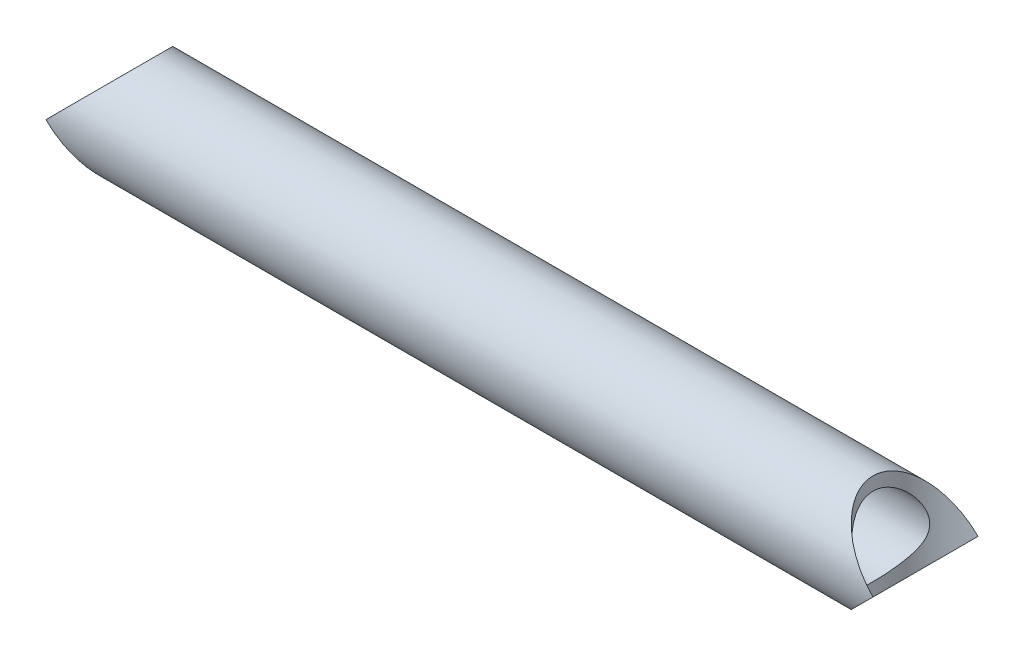
ISO-10303-21;
HEADER;
FILE_DESCRIPTION(('STEP AP214'),'2;1');
FILE_NAME('part.step','',(''),(''),'','','');
FILE_SCHEMA(('AUTOMOTIVE_DESIGN { 1 0 10303 214 1 1 1 1 }'));
ENDSEC;
DATA;
#1=APPLICATION_CONTEXT('core data for automotive mechanical design processes');
#2=APPLICATION_PROTOCOL_DEFINITION('international standard','automotive_design',2000,#1);
#3=PRODUCT_CONTEXT('',#1,'mechanical');
#4=PRODUCT('Part','Part','',(#3));
#5=PRODUCT_RELATED_PRODUCT_CATEGORY('part','',(#4));
#6=PRODUCT_DEFINITION_FORMATION('','',#4);
#7=PRODUCT_DEFINITION_CONTEXT('part definition',#1,'design');
#8=PRODUCT_DEFINITION('design','',#6,#7);
#9=PRODUCT_DEFINITION_SHAPE('','',#8);
#10=(LENGTH_UNIT() NAMED_UNIT(*) SI_UNIT(.MILLI.,.METRE.));
#11=(NAMED_UNIT(*) PLANE_ANGLE_UNIT() SI_UNIT($,.RADIAN.));
#12=(NAMED_UNIT(*) SI_UNIT($,.STERADIAN.) SOLID_ANGLE_UNIT());
#13=UNCERTAINTY_MEASURE_WITH_UNIT(LENGTH_MEASURE(1.E-05),#10,'distance_accuracy_value','');
#14=(GEOMETRIC_REPRESENTATION_CONTEXT(3) GLOBAL_UNCERTAINTY_ASSIGNED_CONTEXT((#13)) GLOBAL_UNIT_ASSIGNED_CONTEXT((#10,
#11,#12)) REPRESENTATION_CONTEXT('',''));
#15=CARTESIAN_POINT('',(0.,0.,0.));
#16=DIRECTION('',(0.,0.,1.));
#17=DIRECTION('',(1.,0.,0.));
#18=AXIS2_PLACEMENT_3D('',#15,#16,#17);
#19=CARTESIAN_POINT('',(150.,0.,0.));
#20=DIRECTION('',(-1.,0.,0.));
#21=DIRECTION('',(0.,0.,1.));
#22=AXIS2_PLACEMENT_3D('',#19,#20,#21);
#23=CYLINDRICAL_SURFACE('',#22,7.112);
#24=CARTESIAN_POINT('',(143.663985400901,0.,7.112));
#25=CARTESIAN_POINT('',(143.663996641076,-0.166349670109117,7.11200542496663));
#26=CARTESIAN_POINT('',(143.657404223324,-0.332656715788198,7.10615199880944));
#27=CARTESIAN_POINT('',(143.631470740375,-0.663523825017278,7.08292127323138));
#28=CARTESIAN_POINT('',(143.612124974971,-0.828083221748087,7.06553972514323));
#29=CARTESIAN_POINT('',(143.561744636123,-1.15416223004984,7.01966098991535));
#30=CARTESIAN_POINT('',(143.530684563052,-1.31567439721789,6.99113954867282));
#31=CARTESIAN_POINT('',(143.458460168107,-1.63424608097507,6.92360605423908));
#32=CARTESIAN_POINT('',(143.417289790225,-1.79130286568734,6.88458771212787));
#33=CARTESIAN_POINT('',(143.32727049625,-2.09795951420525,6.79736460316442));
#34=CARTESIAN_POINT('',(143.278538761654,-2.2476335446951,6.74929797045726));
#35=CARTESIAN_POINT('',(143.174668643161,-2.54144419684285,6.64424190459665));
#36=CARTESIAN_POINT('',(143.119530964134,-2.68558142541811,6.5872534529055));
#37=CARTESIAN_POINT('',(142.946854896937,-3.10942256788375,6.40365866022099));
#38=CARTESIAN_POINT('',(142.821982070976,-3.38078378140906,6.26435673087727));
#39=CARTESIAN_POINT('',(142.614545086204,-3.79713432089284,6.01627855015697));
#40=CARTESIAN_POINT('',(142.534819523203,-3.94959627846688,5.91727408898425));
#41=CARTESIAN_POINT('',(142.373835892581,-4.24603410366044,5.70829336546771));
#42=CARTESIAN_POINT('',(142.2925776999,-4.39000927477523,5.59831620459077));
#43=CARTESIAN_POINT('',(142.130093006519,-4.66939820716648,5.36750853203372));
#44=CARTESIAN_POINT('',(142.048866715486,-4.80479949311307,5.24666279766905));
#45=CARTESIAN_POINT('',(141.888061556412,-5.06646938894745,4.99444196004728));
#46=CARTESIAN_POINT('',(141.808482693744,-5.19273796904927,4.86306682245189));
#47=CARTESIAN_POINT('',(141.636624067042,-5.46017346508923,4.56237823124014));
#48=CARTESIAN_POINT('',(141.545023387841,-5.59920216668466,4.39075994838316));
#49=CARTESIAN_POINT('',(141.36862628109,-5.86216963735668,4.03296442783786));
#50=CARTESIAN_POINT('',(141.283831365253,-5.98610505702061,3.84678397359704));
#51=CARTESIAN_POINT('',(141.123576020029,-6.21713184733541,3.46096432873019));
#52=CARTESIAN_POINT('',(141.048098268393,-6.32425457958228,3.26135121340756));
#53=CARTESIAN_POINT('',(140.908635931519,-6.52016509318987,2.84954555651433));
#54=CARTESIAN_POINT('',(140.844645346866,-6.60896244900998,2.63735965881644));
#55=CARTESIAN_POINT('',(140.74745668559,-6.7428410088665,2.26736286905207));
#56=CARTESIAN_POINT('',(140.710776204828,-6.79305007975762,2.11229960346451));
#57=CARTESIAN_POINT('',(140.644792625311,-6.88300525963278,1.79764750134156));
#58=CARTESIAN_POINT('',(140.615487773836,-6.92275385451097,1.63805975003805));
#59=CARTESIAN_POINT('',(140.564853362971,-6.99124038582518,1.31540267475928));
#60=CARTESIAN_POINT('',(140.54351850093,-7.01998564339596,1.15233574220806));
#61=CARTESIAN_POINT('',(140.509246017588,-7.06608578872199,0.823712741278338));
#62=CARTESIAN_POINT('',(140.496308696254,-7.08344026958986,0.658156584198852));
#63=CARTESIAN_POINT('',(140.479096513059,-7.10651684632692,0.325354079998925));
#64=CARTESIAN_POINT('',(140.474844029849,-7.11220889114596,0.158104479624482));
#65=CARTESIAN_POINT('',(140.475164727068,-7.11177938083808,-0.176370252527408));
#66=CARTESIAN_POINT('',(140.479737872744,-7.10565787223131,-0.343595384398614));
#67=CARTESIAN_POINT('',(140.497608099073,-7.08169714102487,-0.676764225577558));
#68=CARTESIAN_POINT('',(140.510906931535,-7.06385556544857,-0.842707670797739));
#69=CARTESIAN_POINT('',(140.545934688785,-7.0167312617276,-1.17205052867149));
#70=CARTESIAN_POINT('',(140.567663562189,-6.98744860331889,-1.3354499568251));
#71=CARTESIAN_POINT('',(140.618223329213,-6.91904371625514,-1.65314148305557));
#72=CARTESIAN_POINT('',(140.646789565119,-6.88028722295748,-1.80755478326129));
#73=CARTESIAN_POINT('',(140.710826490523,-6.79297702240907,-2.11214174822096));
#74=CARTESIAN_POINT('',(140.746299584904,-6.74441990248373,-2.26231391534985));
#75=CARTESIAN_POINT('',(140.862157284933,-6.58486841142567,-2.70525009366833));
#76=CARTESIAN_POINT('',(140.952018305287,-6.45994330046454,-2.99066416134719));
#77=CARTESIAN_POINT('',(141.162195416905,-6.16230481700326,-3.56694153174842));
#78=CARTESIAN_POINT('',(141.28475977353,-5.98587375085425,-3.85502703449937));
#79=CARTESIAN_POINT('',(141.546229043831,-5.59836645467707,-4.39891475025042));
#80=CARTESIAN_POINT('',(141.685148133142,-5.38726010592607,-4.65468855278165));
#81=CARTESIAN_POINT('',(141.913538546123,-5.02560742572235,-5.03612242565989));
#82=CARTESIAN_POINT('',(142.000452347553,-4.88480641586235,-5.17277156285501));
#83=CARTESIAN_POINT('',(142.175381088262,-4.59274197273799,-5.43374777854851));
#84=CARTESIAN_POINT('',(142.263396238067,-4.44147651332437,-5.55807245935771));
#85=CARTESIAN_POINT('',(142.438557956338,-4.12881411640284,-5.7941209208767));
#86=CARTESIAN_POINT('',(142.525704079796,-3.96741226889234,-5.90583852036448));
#87=CARTESIAN_POINT('',(142.696845667575,-3.63473952919308,-6.11620224003216));
#88=CARTESIAN_POINT('',(142.780841850923,-3.46347091217881,-6.21485135649468));
#89=CARTESIAN_POINT('',(142.926803073655,-3.14652775194739,-6.38005576529697));
#90=CARTESIAN_POINT('',(142.989806456781,-3.00261489050363,-6.44907871797221));
#91=CARTESIAN_POINT('',(143.110631172513,-2.70855925252956,-6.57799562389626));
#92=CARTESIAN_POINT('',(143.16845089203,-2.55841455785012,-6.63788673946843));
#93=CARTESIAN_POINT('',(143.277051485244,-2.25241508898873,-6.74785545887661));
#94=CARTESIAN_POINT('',(143.327844828927,-2.09657106788757,-6.7979505152793));
#95=CARTESIAN_POINT('',(143.420599194443,-1.77943355603832,-6.88776335701628));
#96=CARTESIAN_POINT('',(143.462566466565,-1.61814401617663,-6.92748849077932));
#97=CARTESIAN_POINT('',(143.528747567747,-1.32235374921501,-6.98928851362768));
#98=CARTESIAN_POINT('',(143.554823707848,-1.18867125984898,-7.01328889667961));
#99=CARTESIAN_POINT('',(143.599077128544,-0.918919716796928,-7.05370212085708));
#100=CARTESIAN_POINT('',(143.617258305154,-0.782851874806343,-7.07011870469968));
#101=CARTESIAN_POINT('',(143.645010273683,-0.509230855349401,-7.09507448976966));
#102=CARTESIAN_POINT('',(143.654588348006,-0.371679034068791,-7.1036203536057));
#103=CARTESIAN_POINT('',(143.664756179516,-0.0959738247705464,-7.11268988511824));
#104=CARTESIAN_POINT('',(143.665345826277,0.0421795706167964,-7.11321345423781));
#105=CARTESIAN_POINT('',(143.657506300121,0.318034543766366,-7.10622471297609));
#106=CARTESIAN_POINT('',(143.649076614603,0.45573609540244,-7.09871194585961));
#107=CARTESIAN_POINT('',(143.62357269076,0.729646414276574,-7.07580900921567));
#108=CARTESIAN_POINT('',(143.606498445423,0.865855180303627,-7.06041883329824));
#109=CARTESIAN_POINT('',(143.543209648309,1.27126436694007,-7.00277562590728));
#110=CARTESIAN_POINT('',(143.484936943672,1.5370283504157,-6.9490561057891));
#111=CARTESIAN_POINT('',(143.317132750559,2.15273296707965,-6.78842189428306));
#112=CARTESIAN_POINT('',(143.196540785869,2.49633961006653,-6.66905595019428));
#113=CARTESIAN_POINT('',(142.996170731099,2.98848255902273,-6.45613089726207));
#114=CARTESIAN_POINT('',(142.926031543472,3.14884236925141,-6.37939002326902));
#115=CARTESIAN_POINT('',(142.781255570958,3.46185484238735,-6.21508727369586));
#116=CARTESIAN_POINT('',(142.70661919616,3.61450820570286,-6.12752638400678));
#117=CARTESIAN_POINT('',(142.552100604024,3.91709439322333,-5.93883909904807));
#118=CARTESIAN_POINT('',(142.472126243866,4.06675204195008,-5.83734912835664));
#119=CARTESIAN_POINT('',(142.311099170232,4.35761171991588,-5.62355272129721));
#120=CARTESIAN_POINT('',(142.230046092009,4.49881079546883,-5.51124254186989));
#121=CARTESIAN_POINT('',(142.068444737338,4.77249257759708,-5.27602355138593));
#122=CARTESIAN_POINT('',(141.987896626512,4.9049725472016,-5.15311144004202));
#123=CARTESIAN_POINT('',(141.828790627417,5.1607756831624,-4.89690789144948));
#124=CARTESIAN_POINT('',(141.750232748149,5.28409880811863,-4.76361640727908));
#125=CARTESIAN_POINT('',(141.580490779077,5.5457123062592,-4.4580321060661));
#126=CARTESIAN_POINT('',(141.490078396175,5.68178180947599,-4.28339310361036));
#127=CARTESIAN_POINT('',(141.316542611444,5.93854336543239,-3.9196684484196));
#128=CARTESIAN_POINT('',(141.233420816621,6.05923203053832,-3.73057962772754));
#129=CARTESIAN_POINT('',(141.076977123878,6.2834458414807,-3.33910771442353));
#130=CARTESIAN_POINT('',(141.003638417702,6.38700050069393,-3.13674833820492));
#131=CARTESIAN_POINT('',(140.868924415473,6.57539334587951,-2.71974565002297));
#132=CARTESIAN_POINT('',(140.80754269537,6.66024158536909,-2.50510901481499));
#133=CARTESIAN_POINT('',(140.715393815462,6.78675814595222,-2.13227461522512));
#134=CARTESIAN_POINT('',(140.680991558013,6.83371298620662,-1.97674507534375));
#135=CARTESIAN_POINT('',(140.619652856416,6.91712609051747,-1.6614688676097));
#136=CARTESIAN_POINT('',(140.592714647706,6.9535868355434,-1.50172320628024));
#137=CARTESIAN_POINT('',(140.546857460992,7.01550104589064,-1.1790900612005));
#138=CARTESIAN_POINT('',(140.527932991382,7.04096204929096,-1.01620480921771));
#139=CARTESIAN_POINT('',(140.498475501074,7.08054108228796,-0.688296673510385));
#140=CARTESIAN_POINT('',(140.487942801317,7.09465867806037,-0.52327370827507));
#141=CARTESIAN_POINT('',(140.475488860591,7.11134744934052,-0.191964734652409));
#142=CARTESIAN_POINT('',(140.473586037086,7.11389393035908,-0.0256767829131859));
#143=CARTESIAN_POINT('',(140.478484503294,7.1073329048559,0.306538495074221));
#144=CARTESIAN_POINT('',(140.485285753283,7.09822545152152,0.472465822964793));
#145=CARTESIAN_POINT('',(140.507443612364,7.06849657447413,0.802745158130645));
#146=CARTESIAN_POINT('',(140.522802288789,7.04787236850245,0.967096774977191));
#147=CARTESIAN_POINT('',(140.561742585791,6.99542206698351,1.29300441706732));
#148=CARTESIAN_POINT('',(140.585324208618,6.96359596837392,1.45456044154664));
#149=CARTESIAN_POINT('',(140.639537635107,6.8901215519631,1.76983157870545));
#150=CARTESIAN_POINT('',(140.669978213428,6.84873900315007,1.92364173484919));
#151=CARTESIAN_POINT('',(140.737649596773,6.75625932977068,2.22680358861804));
#152=CARTESIAN_POINT('',(140.77488277612,6.70515880806675,2.37615370594835));
#153=CARTESIAN_POINT('',(140.895812457063,6.53812698803756,2.81634201922741));
#154=CARTESIAN_POINT('',(140.988779797285,6.40841112903583,3.09954677330455));
#155=CARTESIAN_POINT('',(141.20566134466,6.09989624783705,3.67288004200389));
#156=CARTESIAN_POINT('',(141.33192293185,5.91713175146481,3.95994683398007));
#157=CARTESIAN_POINT('',(141.600091989407,5.51684353452852,4.50092695837864));
#158=CARTESIAN_POINT('',(141.742014784037,5.2992856739813,4.75480727822288));
#159=CARTESIAN_POINT('',(141.974518881211,4.92697289614148,5.13273597541763));
#160=CARTESIAN_POINT('',(142.062869025868,4.78201353222476,5.26802538686025));
#161=CARTESIAN_POINT('',(142.240222600683,4.48149598056995,5.52593438273534));
#162=CARTESIAN_POINT('',(142.329226165596,4.32593554844846,5.64855127031578));
#163=CARTESIAN_POINT('',(142.505790822161,4.00451376498299,5.88079347412538));
#164=CARTESIAN_POINT('',(142.593351423668,3.83864900114662,5.990414451159));
#165=CARTESIAN_POINT('',(142.764547545344,3.4969354059492,6.19610996690498));
#166=CARTESIAN_POINT('',(142.848184187093,3.32108945964724,6.29218839240146));
#167=CARTESIAN_POINT('',(143.052042353535,2.86202535372487,6.51807838352035));
#168=CARTESIAN_POINT('',(143.167798068711,2.57184715829216,6.63830685484071));
#169=CARTESIAN_POINT('',(143.320074409277,2.12044108508451,6.79039175846632));
#170=CARTESIAN_POINT('',(143.367241972707,1.96742228144233,6.8363494457115));
#171=CARTESIAN_POINT('',(143.452770134662,1.65635431704358,6.91830137386875));
#172=CARTESIAN_POINT('',(143.491133966903,1.49830702767772,6.95429927413389));
#173=CARTESIAN_POINT('',(143.569156962711,1.12062728148198,7.0266421379987));
#174=CARTESIAN_POINT('',(143.604380579416,0.899168688515129,7.05851480158679));
#175=CARTESIAN_POINT('',(143.651782312188,0.451779256844752,7.10118560915764));
#176=CARTESIAN_POINT('',(143.663970140291,0.225850343471725,7.11199263460771));
#177=CARTESIAN_POINT('',(143.663985400901,0.,7.112));
#178=B_SPLINE_CURVE_WITH_KNOTS('',3,(#24,#25,#26,#27,#28,#29,#30,#31,#32,#33,#34,#35,#36,#37,
#38,#39,#40,#41,#42,#43,#44,#45,#46,#47,#48,#49,#50,#51,#52,#53,#54,#55,#56,#57,#58,#59,#60,#61,
#62,#63,#64,#65,#66,#67,#68,#69,#70,#71,#72,#73,#74,#75,#76,#77,#78,#79,#80,#81,#82,#83,#84,#85,
#86,#87,#88,#89,#90,#91,#92,#93,#94,#95,#96,#97,#98,#99,#100,#101,#102,#103,#104,#105,#106,#107,
#108,#109,#110,#111,#112,#113,#114,#115,#116,#117,#118,#119,#120,#121,#122,#123,#124,#125,#126,
#127,#128,#129,#130,#131,#132,#133,#134,#135,#136,#137,#138,#139,#140,#141,#142,#143,#144,#145,
#146,#147,#148,#149,#150,#151,#152,#153,#154,#155,#156,#157,#158,#159,#160,#161,#162,#163,#164,
#165,#166,#167,#168,#169,#170,#171,#172,#173,#174,#175,#176,#177),.UNSPECIFIED.,.T.,.F.,(4,2,2,
2,2,2,2,2,2,2,2,2,2,2,2,2,2,2,2,2,2,2,2,2,2,2,2,2,2,2,2,2,2,2,2,2,2,2,2,2,2,2,2,2,2,2,2,2,2,2,2,
2,2,2,2,2,2,2,2,2,2,2,2,2,2,2,2,2,2,2,2,2,2,2,2,2,4),(0.,0.498748895170916,0.997681705509529,
1.49770691733546,1.99803237480797,2.49126199574875,2.98443739606982,3.97005133047027,
4.56517463306934,5.16034670922271,5.75636577522561,6.35238678503394,7.06872833593299,
7.78522856459665,8.50037596186699,9.21514876481289,9.71584895519888,10.216430048331,
10.7166774955708,11.2169428110654,11.7184955666186,12.2200463471295,12.7216978521586,
13.2233462995579,13.7080515850183,14.1929259417111,15.1619655641237,16.2363015664648,
17.3115757131252,17.9548377942057,18.5982247755667,19.2419258499116,19.8854790830145,
20.3998767216546,20.9144338826593,21.4280657900726,21.9413327288156,22.3558205193751,
22.7701035349757,23.1840355344825,23.5979726192964,24.0119332309615,24.4258941784231,
25.2544662623384,26.3975070637287,26.9704939085436,27.543428582766,28.1361131234555,
28.729003434116,29.3220789769726,29.9151572010873,30.6315729380979,31.3481461941631,
32.0634720028903,32.7784124269862,33.2761096415886,33.7736890958948,34.2709270179972,
34.7681839558676,35.2665016175072,35.764817004885,36.2632528292076,36.7616887897907,
37.2476497819256,37.7337809660438,38.7053354883497,39.7904802108588,40.8766963078844,
41.5273785402627,42.1781989610517,42.8292360754406,43.480085956595,44.4803649121144,
44.9796391184534,45.4787296407283,46.1561588817366,46.8333024505011),.UNSPECIFIED.);
#179=CARTESIAN_POINT('',(143.663985400901,0.,7.112));
#180=VERTEX_POINT('',#179);
#181=EDGE_CURVE('E66',#180,#180,#178,.T.);
#182=ORIENTED_EDGE('',*,*,#181,.T.);
#183=EDGE_LOOP('',(#182));
#184=FACE_BOUND('',#183,.T.);
#185=CARTESIAN_POINT('',(6.33601459909934,0.,7.112));
#186=CARTESIAN_POINT('',(6.33600335892449,0.166349670109118,7.11200542496663));
#187=CARTESIAN_POINT('',(6.34259577667554,0.3326567157882,7.10615199880944));
#188=CARTESIAN_POINT('',(6.36852925962474,0.663523825017282,7.08292127323138));
#189=CARTESIAN_POINT('',(6.38787502502887,0.82808322174809,7.06553972514323));
#190=CARTESIAN_POINT('',(6.43825536387737,1.15416223004984,7.01966098991535));
#191=CARTESIAN_POINT('',(6.46931543694829,1.3156743972179,6.99113954867282));
#192=CARTESIAN_POINT('',(6.54153983189278,1.63424608097507,6.92360605423908));
#193=CARTESIAN_POINT('',(6.58271020977503,1.79130286568734,6.88458771212787));
#194=CARTESIAN_POINT('',(6.67272950374994,2.09795951420525,6.79736460316442));
#195=CARTESIAN_POINT('',(6.72146123834602,2.2476335446951,6.74929797045725));
#196=CARTESIAN_POINT('',(6.82533135683914,2.54144419684285,6.64424190459665));
#197=CARTESIAN_POINT('',(6.88046903586578,2.68558142541811,6.5872534529055));
#198=CARTESIAN_POINT('',(7.05314510306324,3.10942256788375,6.40365866022099));
#199=CARTESIAN_POINT('',(7.17801792902439,3.38078378140907,6.26435673087727));
#200=CARTESIAN_POINT('',(7.38545491379638,3.79713432089284,6.01627855015697));
#201=CARTESIAN_POINT('',(7.46518047679747,3.94959627846687,5.91727408898426));
#202=CARTESIAN_POINT('',(7.62616410741871,4.24603410366043,5.70829336546771));
#203=CARTESIAN_POINT('',(7.70742230010037,4.39000927477522,5.59831620459077));
#204=CARTESIAN_POINT('',(7.869906993481,4.66939820716648,5.36750853203373));
#205=CARTESIAN_POINT('',(7.95113328451369,4.80479949311307,5.24666279766906));
#206=CARTESIAN_POINT('',(8.11193844358793,5.06646938894744,4.99444196004729));
#207=CARTESIAN_POINT('',(8.19151730625584,5.19273796904927,4.8630668224519));
#208=CARTESIAN_POINT('',(8.36337593295832,5.46017346508923,4.56237823124015));
#209=CARTESIAN_POINT('',(8.45497661215897,5.59920216668465,4.39075994838316));
#210=CARTESIAN_POINT('',(8.63137371890994,5.86216963735668,4.03296442783786));
#211=CARTESIAN_POINT('',(8.71616863474689,5.98610505702061,3.84678397359704));
#212=CARTESIAN_POINT('',(8.876423979971,6.21713184733541,3.46096432873018));
#213=CARTESIAN_POINT('',(8.9519017316068,6.32425457958229,3.26135121340754));
#214=CARTESIAN_POINT('',(9.09136406848149,6.52016509318988,2.84954555651432));
#215=CARTESIAN_POINT('',(9.15535465313425,6.60896244900999,2.63735965881644));
#216=CARTESIAN_POINT('',(9.25254331441031,6.7428410088665,2.26736286905207));
#217=CARTESIAN_POINT('',(9.28922379517155,6.79305007975762,2.11229960346451));
#218=CARTESIAN_POINT('',(9.35520737468894,6.88300525963278,1.79764750134157));
#219=CARTESIAN_POINT('',(9.38451222616428,6.92275385451097,1.63805975003805));
#220=CARTESIAN_POINT('',(9.43514663702945,6.99124038582518,1.31540267475928));
#221=CARTESIAN_POINT('',(9.45648149906984,7.01998564339596,1.15233574220807));
#222=CARTESIAN_POINT('',(9.49075398241171,7.06608578872199,0.823712741278339));
#223=CARTESIAN_POINT('',(9.50369130374634,7.08344026958986,0.658156584198851));
#224=CARTESIAN_POINT('',(9.52090348694055,7.10651684632692,0.325354079998923));
#225=CARTESIAN_POINT('',(9.52515597015122,7.11220889114596,0.15810447962448));
#226=CARTESIAN_POINT('',(9.52483527293179,7.11177938083808,-0.176370252527408));
#227=CARTESIAN_POINT('',(9.52026212725581,7.10565787223131,-0.343595384398614));
#228=CARTESIAN_POINT('',(9.50239190092742,7.08169714102487,-0.676764225577558));
#229=CARTESIAN_POINT('',(9.48909306846508,7.06385556544857,-0.842707670797738));
#230=CARTESIAN_POINT('',(9.45406531121533,7.0167312617276,-1.17205052867149));
#231=CARTESIAN_POINT('',(9.4323364378109,6.98744860331889,-1.3354499568251));
#232=CARTESIAN_POINT('',(9.38177667078735,6.91904371625514,-1.65314148305557));
#233=CARTESIAN_POINT('',(9.35321043488137,6.88028722295748,-1.80755478326129));
#234=CARTESIAN_POINT('',(9.28917350947745,6.79297702240907,-2.11214174822096));
#235=CARTESIAN_POINT('',(9.25370041509589,6.74441990248373,-2.26231391534984));
#236=CARTESIAN_POINT('',(9.13784271506687,6.58486841142567,-2.70525009366833));
#237=CARTESIAN_POINT('',(9.04798169471301,6.45994330046454,-2.9906641613472));
#238=CARTESIAN_POINT('',(8.83780458309494,6.16230481700326,-3.56694153174842));
#239=CARTESIAN_POINT('',(8.71524022647013,5.98587375085425,-3.85502703449937));
#240=CARTESIAN_POINT('',(8.45377095616874,5.59836645467707,-4.39891475025042));
#241=CARTESIAN_POINT('',(8.31485186685821,5.38726010592608,-4.65468855278165));
#242=CARTESIAN_POINT('',(8.08646145387732,5.02560742572235,-5.03612242565989));
#243=CARTESIAN_POINT('',(7.99954765244654,4.88480641586235,-5.17277156285501));
#244=CARTESIAN_POINT('',(7.82461891173817,4.59274197273799,-5.43374777854851));
#245=CARTESIAN_POINT('',(7.73660376193266,4.44147651332437,-5.55807245935771));
#246=CARTESIAN_POINT('',(7.56144204366245,4.12881411640284,-5.79412092087669));
#247=CARTESIAN_POINT('',(7.47429592020395,3.96741226889234,-5.90583852036448));
#248=CARTESIAN_POINT('',(7.30315433242454,3.63473952919308,-6.11620224003216));
#249=CARTESIAN_POINT('',(7.21915814907688,3.46347091217881,-6.21485135649467));
#250=CARTESIAN_POINT('',(7.07319692634546,3.1465277519474,-6.38005576529697));
#251=CARTESIAN_POINT('',(7.0101935432191,3.00261489050364,-6.44907871797221));
#252=CARTESIAN_POINT('',(6.88936882748657,2.70855925252956,-6.57799562389626));
#253=CARTESIAN_POINT('',(6.8315491079705,2.55841455785013,-6.63788673946843));
#254=CARTESIAN_POINT('',(6.72294851475593,2.25241508898874,-6.74785545887661));
#255=CARTESIAN_POINT('',(6.67215517107287,2.09657106788758,-6.7979505152793));
#256=CARTESIAN_POINT('',(6.5794008055575,1.77943355603832,-6.88776335701628));
#257=CARTESIAN_POINT('',(6.53743353343528,1.61814401617663,-6.92748849077932));
#258=CARTESIAN_POINT('',(6.47125243225309,1.32235374921501,-6.98928851362768));
#259=CARTESIAN_POINT('',(6.44517629215194,1.18867125984898,-7.01328889667962));
#260=CARTESIAN_POINT('',(6.40092287145582,0.918919716796926,-7.05370212085708));
#261=CARTESIAN_POINT('',(6.38274169484604,0.782851874806342,-7.07011870469968));
#262=CARTESIAN_POINT('',(6.35498972631716,0.509230855349399,-7.09507448976966));
#263=CARTESIAN_POINT('',(6.34541165199399,0.371679034068788,-7.10362035360571));
#264=CARTESIAN_POINT('',(6.33524382048395,0.0959738247705411,-7.11268988511824));
#265=CARTESIAN_POINT('',(6.33465417372333,-0.0421795706168025,-7.11321345423781));
#266=CARTESIAN_POINT('',(6.34249369987866,-0.318034543766374,-7.10622471297609));
#267=CARTESIAN_POINT('',(6.35092338539719,-0.45573609540245,-7.09871194585961));
#268=CARTESIAN_POINT('',(6.37642730924043,-0.729646414276583,-7.07580900921567));
#269=CARTESIAN_POINT('',(6.39350155457741,-0.865855180303634,-7.06041883329823));
#270=CARTESIAN_POINT('',(6.45679035169066,-1.27126436694007,-7.00277562590728));
#271=CARTESIAN_POINT('',(6.51506305632847,-1.53702835041571,-6.94905610578909));
#272=CARTESIAN_POINT('',(6.68286724944109,-2.15273296707966,-6.78842189428306));
#273=CARTESIAN_POINT('',(6.80345921413136,-2.49633961006653,-6.66905595019428));
#274=CARTESIAN_POINT('',(7.00382926890085,-2.98848255902274,-6.45613089726207));
#275=CARTESIAN_POINT('',(7.07396845652826,-3.14884236925142,-6.37939002326902));
#276=CARTESIAN_POINT('',(7.21874442904213,-3.46185484238736,-6.21508727369585));
#277=CARTESIAN_POINT('',(7.29338080383978,-3.61450820570288,-6.12752638400677));
#278=CARTESIAN_POINT('',(7.44789939597622,-3.91709439322333,-5.93883909904807));
#279=CARTESIAN_POINT('',(7.52787375613392,-4.06675204195008,-5.83734912835663));
#280=CARTESIAN_POINT('',(7.68890082976803,-4.35761171991589,-5.62355272129721));
#281=CARTESIAN_POINT('',(7.76995390799055,-4.49881079546884,-5.51124254186989));
#282=CARTESIAN_POINT('',(7.93155526266212,-4.77249257759709,-5.27602355138592));
#283=CARTESIAN_POINT('',(8.01210337348841,-4.90497254720161,-5.153111440042));
#284=CARTESIAN_POINT('',(8.17120937258259,-5.16077568316241,-4.89690789144947));
#285=CARTESIAN_POINT('',(8.24976725185115,-5.28409880811864,-4.76361640727907));
#286=CARTESIAN_POINT('',(8.41950922092312,-5.54571230625921,-4.45803210606608));
#287=CARTESIAN_POINT('',(8.50992160382456,-5.68178180947601,-4.28339310361034));
#288=CARTESIAN_POINT('',(8.68345738855588,-5.93854336543241,-3.91966844841957));
#289=CARTESIAN_POINT('',(8.76657918337927,-6.05923203053834,-3.73057962772751));
#290=CARTESIAN_POINT('',(8.92302287612235,-6.28344584148071,-3.33910771442351));
#291=CARTESIAN_POINT('',(8.9963615822975,-6.38700050069394,-3.1367483382049));
#292=CARTESIAN_POINT('',(9.13107558452741,-6.57539334587951,-2.71974565002296));
#293=CARTESIAN_POINT('',(9.19245730463008,-6.66024158536909,-2.50510901481497));
#294=CARTESIAN_POINT('',(9.28460618453761,-6.78675814595223,-2.13227461522511));
#295=CARTESIAN_POINT('',(9.31900844198671,-6.83371298620663,-1.97674507534374));
#296=CARTESIAN_POINT('',(9.38034714358356,-6.91712609051747,-1.66146886760969));
#297=CARTESIAN_POINT('',(9.40728535229377,-6.95358683554341,-1.50172320628023));
#298=CARTESIAN_POINT('',(9.45314253900795,-7.01550104589065,-1.17909006120049));
#299=CARTESIAN_POINT('',(9.47206700861848,-7.04096204929097,-1.01620480921769));
#300=CARTESIAN_POINT('',(9.50152449892623,-7.08054108228796,-0.688296673510373));
#301=CARTESIAN_POINT('',(9.51205719868332,-7.09465867806037,-0.523273708275059));
#302=CARTESIAN_POINT('',(9.5245111394085,-7.11134744934052,-0.191964734652399));
#303=CARTESIAN_POINT('',(9.52641396291372,-7.11389393035908,-0.0256767829131747));
#304=CARTESIAN_POINT('',(9.52151549670572,-7.1073329048559,0.306538495074232));
#305=CARTESIAN_POINT('',(9.51471424671698,-7.09822545152152,0.472465822964802));
#306=CARTESIAN_POINT('',(9.49255638763573,-7.06849657447413,0.802745158130651));
#307=CARTESIAN_POINT('',(9.47719771121124,-7.04787236850245,0.967096774977197));
#308=CARTESIAN_POINT('',(9.43825741420857,-6.99542206698351,1.29300441706732));
#309=CARTESIAN_POINT('',(9.41467579138244,-6.96359596837392,1.45456044154665));
#310=CARTESIAN_POINT('',(9.36046236489287,-6.8901215519631,1.76983157870545));
#311=CARTESIAN_POINT('',(9.33002178657215,-6.84873900315007,1.92364173484919));
#312=CARTESIAN_POINT('',(9.26235040322652,-6.75625932977068,2.22680358861804));
#313=CARTESIAN_POINT('',(9.22511722387985,-6.70515880806675,2.37615370594835));
#314=CARTESIAN_POINT('',(9.10418754293705,-6.53812698803756,2.81634201922741));
#315=CARTESIAN_POINT('',(9.01122020271543,-6.40841112903583,3.09954677330455));
#316=CARTESIAN_POINT('',(8.7943386553402,-6.09989624783704,3.67288004200389));
#317=CARTESIAN_POINT('',(8.66807706815018,-5.91713175146481,3.95994683398007));
#318=CARTESIAN_POINT('',(8.39990801059328,-5.51684353452852,4.50092695837864));
#319=CARTESIAN_POINT('',(8.2579852159629,-5.2992856739813,4.75480727822288));
#320=CARTESIAN_POINT('',(8.02548111878881,-4.92697289614148,5.13273597541763));
#321=CARTESIAN_POINT('',(7.93713097413155,-4.78201353222476,5.26802538686025));
#322=CARTESIAN_POINT('',(7.75977739931732,-4.48149598056995,5.52593438273534));
#323=CARTESIAN_POINT('',(7.67077383440393,-4.32593554844847,5.64855127031578));
#324=CARTESIAN_POINT('',(7.49420917783869,-4.00451376498299,5.88079347412537));
#325=CARTESIAN_POINT('',(7.40664857633164,-3.83864900114663,5.990414451159));
#326=CARTESIAN_POINT('',(7.23545245465625,-3.4969354059492,6.19610996690498));
#327=CARTESIAN_POINT('',(7.15181581290699,-3.32108945964724,6.29218839240146));
#328=CARTESIAN_POINT('',(6.94795764646481,-2.86202535372487,6.51807838352035));
#329=CARTESIAN_POINT('',(6.83220193128906,-2.57184715829215,6.63830685484072));
#330=CARTESIAN_POINT('',(6.67992559072333,-2.1204410850845,6.79039175846632));
#331=CARTESIAN_POINT('',(6.63275802729256,-1.96742228144233,6.8363494457115));
#332=CARTESIAN_POINT('',(6.54722986533816,-1.65635431704359,6.91830137386875));
#333=CARTESIAN_POINT('',(6.50886603309724,-1.49830702767772,6.95429927413389));
#334=CARTESIAN_POINT('',(6.43084303728903,-1.12062728148199,7.0266421379987));
#335=CARTESIAN_POINT('',(6.39561942058413,-0.899168688515131,7.05851480158679));
#336=CARTESIAN_POINT('',(6.34821768781156,-0.451779256844753,7.10118560915764));
#337=CARTESIAN_POINT('',(6.33602985970882,-0.225850343471725,7.11199263460771));
#338=CARTESIAN_POINT('',(6.33601459909934,0.,7.112));
#339=B_SPLINE_CURVE_WITH_KNOTS('',3,(#185,#186,#187,#188,#189,#190,#191,#192,#193,#194,#195,
#196,#197,#198,#199,#200,#201,#202,#203,#204,#205,#206,#207,#208,#209,#210,#211,#212,#213,#214,
#215,#216,#217,#218,#219,#220,#221,#222,#223,#224,#225,#226,#227,#228,#229,#230,#231,#232,#233,
#234,#235,#236,#237,#238,#239,#240,#241,#242,#243,#244,#245,#246,#247,#248,#249,#250,#251,#252,
#253,#254,#255,#256,#257,#258,#259,#260,#261,#262,#263,#264,#265,#266,#267,#268,#269,#270,#271,
#272,#273,#274,#275,#276,#277,#278,#279,#280,#281,#282,#283,#284,#285,#286,#287,#288,#289,#290,
#291,#292,#293,#294,#295,#296,#297,#298,#299,#300,#301,#302,#303,#304,#305,#306,#307,#308,#309,
#310,#311,#312,#313,#314,#315,#316,#317,#318,#319,#320,#321,#322,#323,#324,#325,#326,#327,#328,
#329,#330,#331,#332,#333,#334,#335,#336,#337,#338),.UNSPECIFIED.,.T.,.F.,(4,2,2,2,2,2,2,2,2,2,2,
2,2,2,2,2,2,2,2,2,2,2,2,2,2,2,2,2,2,2,2,2,2,2,2,2,2,2,2,2,2,2,2,2,2,2,2,2,2,2,2,2,2,2,2,2,2,2,2,
2,2,2,2,2,2,2,2,2,2,2,2,2,2,2,2,2,4),(0.,0.498748895170918,0.997681705509533,1.49770691733546,
1.99803237480797,2.49126199574875,2.98443739606982,3.97005133047027,4.56517463306933,
5.16034670922269,5.75636577522561,6.35238678503394,7.06872833593298,7.78522856459666,
8.50037596186701,9.2151487648129,9.71584895519888,10.216430048331,10.7166774955708,
11.2169428110654,11.7184955666186,12.2200463471295,12.7216978521586,13.2233462995579,
13.7080515850183,14.1929259417111,15.1619655641237,16.2363015664648,17.3115757131252,
17.9548377942057,18.5982247755667,19.2419258499116,19.8854790830145,20.3998767216546,
20.9144338826593,21.4280657900725,21.9413327288156,22.3558205193751,22.7701035349757,
23.1840355344825,23.5979726192964,24.0119332309615,24.4258941784231,25.2544662623384,
26.3975070637287,26.9704939085436,27.543428582766,28.1361131234555,28.729003434116,
29.3220789769726,29.9151572010873,30.6315729380979,31.3481461941631,32.0634720028903,
32.7784124269862,33.2761096415886,33.7736890958948,34.2709270179973,34.7681839558676,
35.2665016175072,35.764817004885,36.2632528292076,36.7616887897907,37.2476497819256,
37.7337809660438,38.7053354883497,39.7904802108587,40.8766963078844,41.5273785402627,
42.1781989610517,42.8292360754406,43.4800859565949,44.4803649121144,44.9796391184534,
45.4787296407282,46.1561588817365,46.8333024505011),.UNSPECIFIED.);
#340=CARTESIAN_POINT('',(6.33601459909934,0.,7.112));
#341=VERTEX_POINT('',#340);
#342=EDGE_CURVE('E37',#341,#341,#339,.T.);
#343=ORIENTED_EDGE('',*,*,#342,.T.);
#344=EDGE_LOOP('',(#343));
#345=FACE_BOUND('',#344,.T.);
#346=ADVANCED_FACE('F33',(#184,#345),#23,.F.);
#347=CARTESIAN_POINT('',(150.,25.,0.));
#348=DIRECTION('',(0.,-1.,0.));
#349=DIRECTION('',(0.,0.,-1.));
#350=AXIS2_PLACEMENT_3D('',#347,#348,#349);
#351=CYLINDRICAL_SURFACE('',#350,9.525);
#352=ORIENTED_EDGE('',*,*,#181,.F.);
#353=EDGE_LOOP('',(#352));
#354=FACE_BOUND('',#353,.T.);
#355=CARTESIAN_POINT('',(150.,0.,0.));
#356=DIRECTION('',(-0.707106781186547,-0.707106781186547,0.));
#357=DIRECTION('',(-0.707106781186547,0.707106781186547,0.));
#358=AXIS2_PLACEMENT_3D('',#355,#356,#357);
#359=ELLIPSE('',#358,13.4703841816037,9.525);
#360=CARTESIAN_POINT('',(150.,0.,-9.525));
#361=VERTEX_POINT('',#360);
#362=CARTESIAN_POINT('',(150.,0.,9.525));
#363=VERTEX_POINT('',#362);
#364=EDGE_CURVE('E58',#361,#363,#359,.F.);
#365=ORIENTED_EDGE('',*,*,#364,.T.);
#366=CARTESIAN_POINT('',(150.,0.,0.));
#367=DIRECTION('',(-0.707106781186547,0.707106781186547,0.));
#368=DIRECTION('',(-0.707106781186547,-0.707106781186547,0.));
#369=AXIS2_PLACEMENT_3D('',#366,#367,#368);
#370=ELLIPSE('',#369,13.4703841816037,9.525);
#371=EDGE_CURVE('E63',#363,#361,#370,.F.);
#372=ORIENTED_EDGE('',*,*,#371,.T.);
#373=EDGE_LOOP('',(#365,#372));
#374=FACE_BOUND('',#373,.T.);
#375=ADVANCED_FACE('F64',(#354,#374),#351,.F.);
#376=CARTESIAN_POINT('',(0.,25.,0.));
#377=DIRECTION('',(0.,-1.,0.));
#378=DIRECTION('',(0.,0.,-1.));
#379=AXIS2_PLACEMENT_3D('',#376,#377,#378);
#380=CYLINDRICAL_SURFACE('',#379,9.525);
#381=ORIENTED_EDGE('',*,*,#342,.F.);
#382=EDGE_LOOP('',(#381));
#383=FACE_BOUND('',#382,.T.);
#384=CARTESIAN_POINT('',(0.,0.,0.));
#385=DIRECTION('',(-0.707106781186547,-0.707106781186547,0.));
#386=DIRECTION('',(-0.707106781186547,0.707106781186547,0.));
#387=AXIS2_PLACEMENT_3D('',#384,#385,#386);
#388=ELLIPSE('',#387,13.4703841816037,9.525);
#389=CARTESIAN_POINT('',(0.,0.,-9.525));
#390=VERTEX_POINT('',#389);
#391=CARTESIAN_POINT('',(0.,0.,9.525));
#392=VERTEX_POINT('',#391);
#393=EDGE_CURVE('E11',#390,#392,#388,.T.);
#394=ORIENTED_EDGE('',*,*,#393,.T.);
#395=CARTESIAN_POINT('',(0.,0.,0.));
#396=DIRECTION('',(-0.707106781186547,0.707106781186547,0.));
#397=DIRECTION('',(-0.707106781186547,-0.707106781186547,0.));
#398=AXIS2_PLACEMENT_3D('',#395,#396,#397);
#399=ELLIPSE('',#398,13.4703841816037,9.525);
#400=EDGE_CURVE('E46',#392,#390,#399,.T.);
#401=ORIENTED_EDGE('',*,*,#400,.T.);
#402=EDGE_LOOP('',(#394,#401));
#403=FACE_BOUND('',#402,.T.);
#404=ADVANCED_FACE('F80',(#383,#403),#380,.F.);
#405=CARTESIAN_POINT('',(150.,0.,0.));
#406=DIRECTION('',(-1.,0.,0.));
#407=DIRECTION('',(0.,0.,1.));
#408=AXIS2_PLACEMENT_3D('',#405,#406,#407);
#409=CYLINDRICAL_SURFACE('',#408,9.525);
#410=ORIENTED_EDGE('',*,*,#364,.F.);
#411=ORIENTED_EDGE('',*,*,#371,.F.);
#412=EDGE_LOOP('',(#410,#411));
#413=FACE_BOUND('',#412,.T.);
#414=ORIENTED_EDGE('',*,*,#393,.F.);
#415=ORIENTED_EDGE('',*,*,#400,.F.);
#416=EDGE_LOOP('',(#414,#415));
#417=FACE_BOUND('',#416,.T.);
#418=ADVANCED_FACE('F35',(#413,#417),#409,.T.);
#419=CLOSED_SHELL('',(#346,#375,#404,#418));
#420=MANIFOLD_SOLID_BREP('B2',#419);
#421=ADVANCED_BREP_SHAPE_REPRESENTATION('',(#18,#420),#14);
#422=SHAPE_DEFINITION_REPRESENTATION(#9,#421);
ENDSEC;
END-ISO-10303-21;
